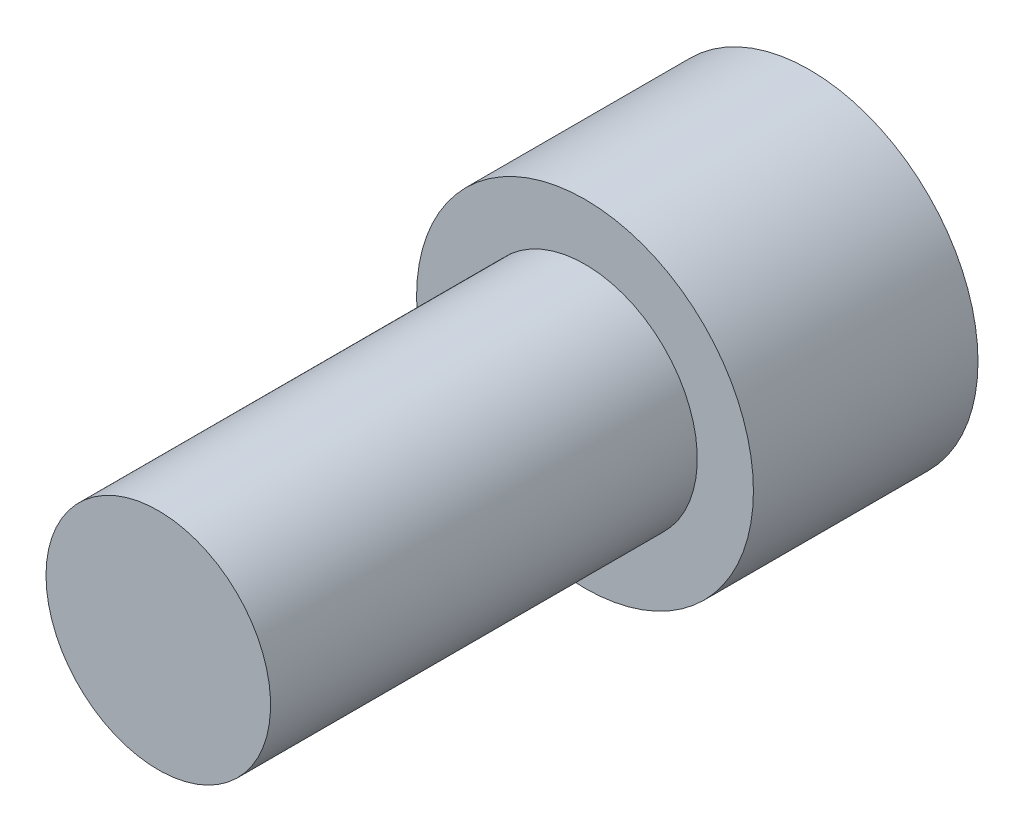
ISO-10303-21;
HEADER;
FILE_DESCRIPTION(('STEP AP214'),'2;1');
FILE_NAME('part.step','',(''),(''),'','','');
FILE_SCHEMA(('AUTOMOTIVE_DESIGN { 1 0 10303 214 1 1 1 1 }'));
ENDSEC;
DATA;
#1=APPLICATION_CONTEXT('core data for automotive mechanical design processes');
#2=APPLICATION_PROTOCOL_DEFINITION('international standard','automotive_design',2000,#1);
#3=PRODUCT_CONTEXT('',#1,'mechanical');
#4=PRODUCT('Part','Part','',(#3));
#5=PRODUCT_RELATED_PRODUCT_CATEGORY('part','',(#4));
#6=PRODUCT_DEFINITION_FORMATION('','',#4);
#7=PRODUCT_DEFINITION_CONTEXT('part definition',#1,'design');
#8=PRODUCT_DEFINITION('design','',#6,#7);
#9=PRODUCT_DEFINITION_SHAPE('','',#8);
#10=(LENGTH_UNIT() NAMED_UNIT(*) SI_UNIT(.MILLI.,.METRE.));
#11=(NAMED_UNIT(*) PLANE_ANGLE_UNIT() SI_UNIT($,.RADIAN.));
#12=(NAMED_UNIT(*) SI_UNIT($,.STERADIAN.) SOLID_ANGLE_UNIT());
#13=UNCERTAINTY_MEASURE_WITH_UNIT(LENGTH_MEASURE(1.E-05),#10,'distance_accuracy_value','');
#14=(GEOMETRIC_REPRESENTATION_CONTEXT(3) GLOBAL_UNCERTAINTY_ASSIGNED_CONTEXT((#13)) GLOBAL_UNIT_ASSIGNED_CONTEXT((#10,
#11,#12)) REPRESENTATION_CONTEXT('',''));
#15=CARTESIAN_POINT('',(0.,0.,0.));
#16=DIRECTION('',(0.,0.,1.));
#17=DIRECTION('',(1.,0.,0.));
#18=AXIS2_PLACEMENT_3D('',#15,#16,#17);
#19=CARTESIAN_POINT('',(0.,0.,250.));
#20=DIRECTION('',(0.,0.,-1.));
#21=DIRECTION('',(-1.,0.,0.));
#22=AXIS2_PLACEMENT_3D('',#19,#20,#21);
#23=CYLINDRICAL_SURFACE('',#22,7.5);
#24=CARTESIAN_POINT('',(0.,0.,10.));
#25=DIRECTION('',(0.,0.,-1.));
#26=DIRECTION('',(-1.,0.,0.));
#27=AXIS2_PLACEMENT_3D('',#24,#25,#26);
#28=CIRCLE('',#27,7.5);
#29=CARTESIAN_POINT('',(-7.5,0.,10.));
#30=VERTEX_POINT('',#29);
#31=EDGE_CURVE('E37',#30,#30,#28,.T.);
#32=ORIENTED_EDGE('',*,*,#31,.T.);
#33=EDGE_LOOP('',(#32));
#34=FACE_BOUND('',#33,.T.);
#35=CARTESIAN_POINT('',(0.,0.,0.));
#36=DIRECTION('',(0.,0.,1.));
#37=DIRECTION('',(1.,0.,0.));
#38=AXIS2_PLACEMENT_3D('',#35,#36,#37);
#39=CIRCLE('',#38,7.5);
#40=CARTESIAN_POINT('',(7.5,0.,0.));
#41=VERTEX_POINT('',#40);
#42=EDGE_CURVE('E10',#41,#41,#39,.T.);
#43=ORIENTED_EDGE('',*,*,#42,.T.);
#44=EDGE_LOOP('',(#43));
#45=FACE_BOUND('',#44,.T.);
#46=ADVANCED_FACE('F31',(#34,#45),#23,.T.);
#47=CARTESIAN_POINT('',(0.,0.,0.));
#48=DIRECTION('',(0.,0.,1.));
#49=DIRECTION('',(1.,0.,0.));
#50=AXIS2_PLACEMENT_3D('',#47,#48,#49);
#51=PLANE('',#50);
#52=ORIENTED_EDGE('',*,*,#42,.F.);
#53=EDGE_LOOP('',(#52));
#54=FACE_BOUND('',#53,.T.);
#55=ADVANCED_FACE('F62',(#54),#51,.F.);
#56=CARTESIAN_POINT('',(0.,0.,10.));
#57=DIRECTION('',(0.,0.,-1.));
#58=DIRECTION('',(-1.,0.,0.));
#59=AXIS2_PLACEMENT_3D('',#56,#57,#58);
#60=PLANE('',#59);
#61=CARTESIAN_POINT('',(0.,0.,10.));
#62=DIRECTION('',(0.,0.,-1.));
#63=DIRECTION('',(-1.,0.,0.));
#64=AXIS2_PLACEMENT_3D('',#61,#62,#63);
#65=CIRCLE('',#64,5.);
#66=CARTESIAN_POINT('',(-5.,0.,10.));
#67=VERTEX_POINT('',#66);
#68=EDGE_CURVE('E41',#67,#67,#65,.T.);
#69=ORIENTED_EDGE('',*,*,#68,.T.);
#70=EDGE_LOOP('',(#69));
#71=FACE_BOUND('',#70,.T.);
#72=ORIENTED_EDGE('',*,*,#31,.F.);
#73=EDGE_LOOP('',(#72));
#74=FACE_BOUND('',#73,.T.);
#75=ADVANCED_FACE('F56',(#71,#74),#60,.F.);
#76=CARTESIAN_POINT('',(0.,0.,29.));
#77=DIRECTION('',(0.,0.,-1.));
#78=DIRECTION('',(-1.,0.,0.));
#79=AXIS2_PLACEMENT_3D('',#76,#77,#78);
#80=CYLINDRICAL_SURFACE('',#79,5.);
#81=CARTESIAN_POINT('',(0.,0.,29.));
#82=DIRECTION('',(0.,0.,-1.));
#83=DIRECTION('',(-1.,0.,0.));
#84=AXIS2_PLACEMENT_3D('',#81,#82,#83);
#85=CIRCLE('',#84,5.);
#86=CARTESIAN_POINT('',(-5.,0.,29.));
#87=VERTEX_POINT('',#86);
#88=EDGE_CURVE('E45',#87,#87,#85,.F.);
#89=ORIENTED_EDGE('',*,*,#88,.F.);
#90=EDGE_LOOP('',(#89));
#91=FACE_BOUND('',#90,.T.);
#92=ORIENTED_EDGE('',*,*,#68,.F.);
#93=EDGE_LOOP('',(#92));
#94=FACE_BOUND('',#93,.T.);
#95=ADVANCED_FACE('F53',(#91,#94),#80,.T.);
#96=CARTESIAN_POINT('',(0.,0.,29.));
#97=DIRECTION('',(0.,0.,-1.));
#98=DIRECTION('',(-1.,0.,0.));
#99=AXIS2_PLACEMENT_3D('',#96,#97,#98);
#100=PLANE('',#99);
#101=ORIENTED_EDGE('',*,*,#88,.T.);
#102=EDGE_LOOP('',(#101));
#103=FACE_BOUND('',#102,.T.);
#104=ADVANCED_FACE('F51',(#103),#100,.F.);
#105=CLOSED_SHELL('',(#46,#55,#75,#95,#104));
#106=MANIFOLD_SOLID_BREP('B2',#105);
#107=ADVANCED_BREP_SHAPE_REPRESENTATION('',(#18,#106),#14);
#108=SHAPE_DEFINITION_REPRESENTATION(#9,#107);
ENDSEC;
END-ISO-10303-21;
